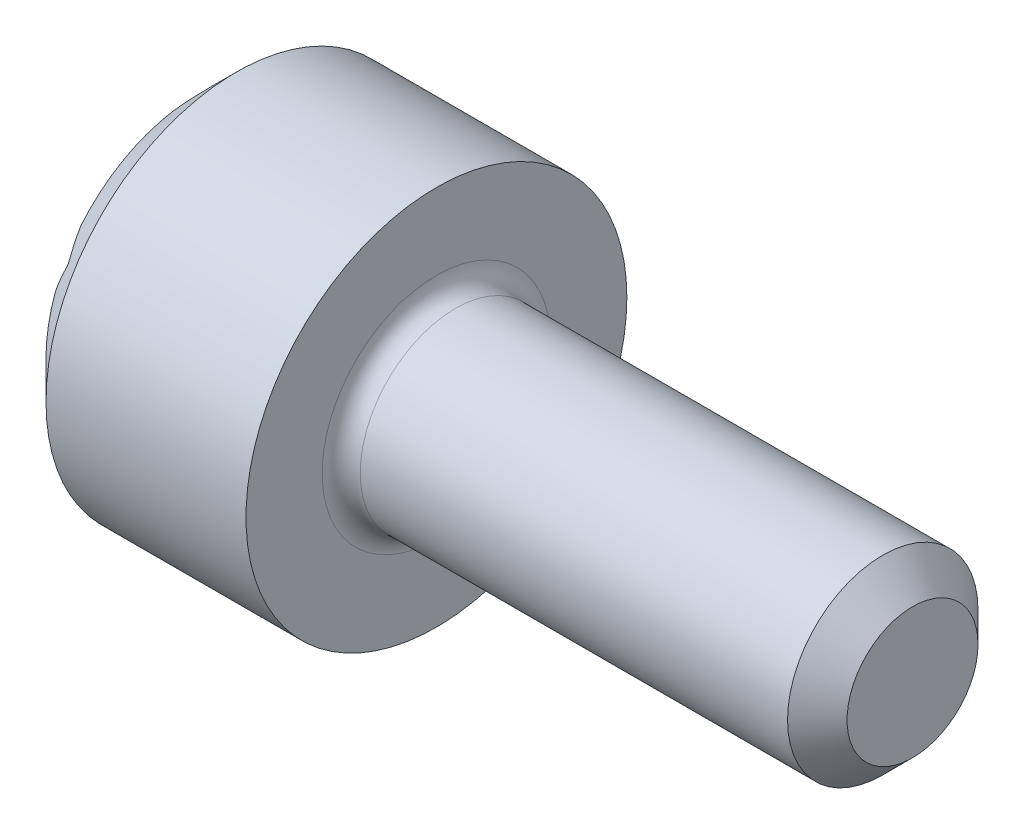
ISO-10303-21;
HEADER;
FILE_DESCRIPTION(('STEP AP214'),'2;1');
FILE_NAME('part.step','',(''),(''),'','','');
FILE_SCHEMA(('AUTOMOTIVE_DESIGN { 1 0 10303 214 1 1 1 1 }'));
ENDSEC;
DATA;
#1=APPLICATION_CONTEXT('core data for automotive mechanical design processes');
#2=APPLICATION_PROTOCOL_DEFINITION('international standard','automotive_design',2000,#1);
#3=PRODUCT_CONTEXT('',#1,'mechanical');
#4=PRODUCT('Part','Part','',(#3));
#5=PRODUCT_RELATED_PRODUCT_CATEGORY('part','',(#4));
#6=PRODUCT_DEFINITION_FORMATION('','',#4);
#7=PRODUCT_DEFINITION_CONTEXT('part definition',#1,'design');
#8=PRODUCT_DEFINITION('design','',#6,#7);
#9=PRODUCT_DEFINITION_SHAPE('','',#8);
#10=(LENGTH_UNIT() NAMED_UNIT(*) SI_UNIT(.MILLI.,.METRE.));
#11=(NAMED_UNIT(*) PLANE_ANGLE_UNIT() SI_UNIT($,.RADIAN.));
#12=(NAMED_UNIT(*) SI_UNIT($,.STERADIAN.) SOLID_ANGLE_UNIT());
#13=UNCERTAINTY_MEASURE_WITH_UNIT(LENGTH_MEASURE(1.E-05),#10,'distance_accuracy_value','');
#14=(GEOMETRIC_REPRESENTATION_CONTEXT(3) GLOBAL_UNCERTAINTY_ASSIGNED_CONTEXT((#13)) GLOBAL_UNIT_ASSIGNED_CONTEXT((#10,
#11,#12)) REPRESENTATION_CONTEXT('',''));
#15=CARTESIAN_POINT('',(0.,0.,0.));
#16=DIRECTION('',(0.,0.,1.));
#17=DIRECTION('',(1.,0.,0.));
#18=AXIS2_PLACEMENT_3D('',#15,#16,#17);
#19=CARTESIAN_POINT('',(0.,0.,0.));
#20=DIRECTION('',(-1.,0.,0.));
#21=DIRECTION('',(0.,0.,1.));
#22=AXIS2_PLACEMENT_3D('',#19,#20,#21);
#23=PLANE('',#22);
#24=DIRECTION('',(0.,0.5,-0.866025403784439));
#25=VECTOR('',#24,1.);
#26=CARTESIAN_POINT('',(0.,1.73205080756888,3.));
#27=LINE('',#26,#25);
#28=CARTESIAN_POINT('',(0.,2.04129977507032,2.46436507609928));
#29=VERTEX_POINT('',#28);
#30=CARTESIAN_POINT('',(0.,3.15485264763631,0.535634923900718));
#31=VERTEX_POINT('',#30);
#32=EDGE_CURVE('E191',#29,#31,#27,.T.);
#33=ORIENTED_EDGE('',*,*,#32,.F.);
#34=CARTESIAN_POINT('',(0.,0.,0.));
#35=DIRECTION('',(-1.,0.,0.));
#36=DIRECTION('',(0.,0.,1.));
#37=AXIS2_PLACEMENT_3D('',#34,#35,#36);
#38=CIRCLE('',#37,3.19999999999999);
#39=EDGE_CURVE('E238',#29,#31,#38,.T.);
#40=ORIENTED_EDGE('',*,*,#39,.T.);
#41=EDGE_LOOP('',(#33,#40));
#42=FACE_BOUND('',#41,.T.);
#43=ADVANCED_FACE('F33',(#42),#23,.T.);
#44=DIRECTION('',(0.,-0.5,-0.866025403784439));
#45=VECTOR('',#44,1.);
#46=CARTESIAN_POINT('',(0.,3.46410161513775,0.));
#47=LINE('',#46,#45);
#48=CARTESIAN_POINT('',(0.,3.15485264763631,-0.53563492390072));
#49=VERTEX_POINT('',#48);
#50=CARTESIAN_POINT('',(0.,2.04129977507032,-2.46436507609928));
#51=VERTEX_POINT('',#50);
#52=EDGE_CURVE('E194',#49,#51,#47,.T.);
#53=ORIENTED_EDGE('',*,*,#52,.F.);
#54=CARTESIAN_POINT('',(0.,0.,0.));
#55=DIRECTION('',(-1.,0.,0.));
#56=DIRECTION('',(0.,0.,1.));
#57=AXIS2_PLACEMENT_3D('',#54,#55,#56);
#58=CIRCLE('',#57,3.19999999999999);
#59=EDGE_CURVE('E236',#49,#51,#58,.T.);
#60=ORIENTED_EDGE('',*,*,#59,.T.);
#61=EDGE_LOOP('',(#53,#60));
#62=FACE_BOUND('',#61,.T.);
#63=ADVANCED_FACE('F303',(#62),#23,.T.);
#64=DIRECTION('',(0.,-1.,0.));
#65=VECTOR('',#64,1.);
#66=CARTESIAN_POINT('',(0.,1.73205080756888,-3.));
#67=LINE('',#66,#65);
#68=CARTESIAN_POINT('',(0.,1.11355287256599,-3.));
#69=VERTEX_POINT('',#68);
#70=CARTESIAN_POINT('',(0.,-1.11355287256599,-3.));
#71=VERTEX_POINT('',#70);
#72=EDGE_CURVE('E156',#69,#71,#67,.T.);
#73=ORIENTED_EDGE('',*,*,#72,.F.);
#74=CARTESIAN_POINT('',(0.,0.,0.));
#75=DIRECTION('',(-1.,0.,0.));
#76=DIRECTION('',(0.,0.,1.));
#77=AXIS2_PLACEMENT_3D('',#74,#75,#76);
#78=CIRCLE('',#77,3.19999999999999);
#79=EDGE_CURVE('E234',#69,#71,#78,.T.);
#80=ORIENTED_EDGE('',*,*,#79,.T.);
#81=EDGE_LOOP('',(#73,#80));
#82=FACE_BOUND('',#81,.T.);
#83=ADVANCED_FACE('F310',(#82),#23,.T.);
#84=DIRECTION('',(0.,-0.5,0.866025403784439));
#85=VECTOR('',#84,1.);
#86=CARTESIAN_POINT('',(0.,-1.73205080756888,-3.));
#87=LINE('',#86,#85);
#88=CARTESIAN_POINT('',(0.,-2.04129977507032,-2.46436507609928));
#89=VERTEX_POINT('',#88);
#90=CARTESIAN_POINT('',(0.,-3.15485264763631,-0.53563492390072));
#91=VERTEX_POINT('',#90);
#92=EDGE_CURVE('E184',#89,#91,#87,.T.);
#93=ORIENTED_EDGE('',*,*,#92,.F.);
#94=CARTESIAN_POINT('',(0.,0.,0.));
#95=DIRECTION('',(-1.,0.,0.));
#96=DIRECTION('',(0.,0.,1.));
#97=AXIS2_PLACEMENT_3D('',#94,#95,#96);
#98=CIRCLE('',#97,3.19999999999999);
#99=EDGE_CURVE('E232',#89,#91,#98,.T.);
#100=ORIENTED_EDGE('',*,*,#99,.T.);
#101=EDGE_LOOP('',(#93,#100));
#102=FACE_BOUND('',#101,.T.);
#103=ADVANCED_FACE('F324',(#102),#23,.T.);
#104=DIRECTION('',(0.,0.5,0.866025403784439));
#105=VECTOR('',#104,1.);
#106=CARTESIAN_POINT('',(0.,-3.46410161513775,0.));
#107=LINE('',#106,#105);
#108=CARTESIAN_POINT('',(0.,-3.15485264763631,0.535634923900722));
#109=VERTEX_POINT('',#108);
#110=CARTESIAN_POINT('',(0.,-2.04129977507032,2.46436507609928));
#111=VERTEX_POINT('',#110);
#112=EDGE_CURVE('E186',#109,#111,#107,.T.);
#113=ORIENTED_EDGE('',*,*,#112,.F.);
#114=CARTESIAN_POINT('',(0.,0.,0.));
#115=DIRECTION('',(-1.,0.,0.));
#116=DIRECTION('',(0.,0.,1.));
#117=AXIS2_PLACEMENT_3D('',#114,#115,#116);
#118=CIRCLE('',#117,3.19999999999999);
#119=EDGE_CURVE('E230',#109,#111,#118,.T.);
#120=ORIENTED_EDGE('',*,*,#119,.T.);
#121=EDGE_LOOP('',(#113,#120));
#122=FACE_BOUND('',#121,.T.);
#123=ADVANCED_FACE('F316',(#122),#23,.T.);
#124=DIRECTION('',(0.,1.,0.));
#125=VECTOR('',#124,1.);
#126=CARTESIAN_POINT('',(0.,-1.73205080756888,3.));
#127=LINE('',#126,#125);
#128=CARTESIAN_POINT('',(0.,-1.11355287256599,3.));
#129=VERTEX_POINT('',#128);
#130=CARTESIAN_POINT('',(0.,1.11355287256599,3.));
#131=VERTEX_POINT('',#130);
#132=EDGE_CURVE('E188',#129,#131,#127,.T.);
#133=ORIENTED_EDGE('',*,*,#132,.F.);
#134=CARTESIAN_POINT('',(0.,0.,0.));
#135=DIRECTION('',(-1.,0.,0.));
#136=DIRECTION('',(0.,0.,1.));
#137=AXIS2_PLACEMENT_3D('',#134,#135,#136);
#138=CIRCLE('',#137,3.19999999999999);
#139=EDGE_CURVE('E228',#129,#131,#138,.T.);
#140=ORIENTED_EDGE('',*,*,#139,.T.);
#141=EDGE_LOOP('',(#133,#140));
#142=FACE_BOUND('',#141,.T.);
#143=ADVANCED_FACE('F306',(#142),#23,.T.);
#144=CARTESIAN_POINT('',(15.,0.,0.));
#145=DIRECTION('',(1.,0.,0.));
#146=DIRECTION('',(0.,0.,-1.));
#147=AXIS2_PLACEMENT_3D('',#144,#145,#146);
#148=CYLINDRICAL_SURFACE('',#147,4.);
#149=CARTESIAN_POINT('',(0.800000000000002,0.,0.));
#150=DIRECTION('',(-1.,0.,0.));
#151=DIRECTION('',(0.,0.,1.));
#152=AXIS2_PLACEMENT_3D('',#149,#150,#151);
#153=CIRCLE('',#152,4.);
#154=CARTESIAN_POINT('',(0.800000000000002,0.,4.));
#155=VERTEX_POINT('',#154);
#156=EDGE_CURVE('E225',#155,#155,#153,.F.);
#157=ORIENTED_EDGE('',*,*,#156,.T.);
#158=EDGE_LOOP('',(#157));
#159=FACE_BOUND('',#158,.T.);
#160=CARTESIAN_POINT('',(5.,0.,0.));
#161=DIRECTION('',(1.,0.,0.));
#162=DIRECTION('',(0.,0.,-1.));
#163=AXIS2_PLACEMENT_3D('',#160,#161,#162);
#164=CIRCLE('',#163,4.);
#165=CARTESIAN_POINT('',(5.,0.,-4.));
#166=VERTEX_POINT('',#165);
#167=EDGE_CURVE('E215',#166,#166,#164,.T.);
#168=ORIENTED_EDGE('',*,*,#167,.F.);
#169=EDGE_LOOP('',(#168));
#170=FACE_BOUND('',#169,.T.);
#171=ADVANCED_FACE('F315',(#159,#170),#148,.T.);
#172=CARTESIAN_POINT('',(5.,0.,-4.));
#173=DIRECTION('',(1.,0.,0.));
#174=DIRECTION('',(0.,0.,-1.));
#175=AXIS2_PLACEMENT_3D('',#172,#173,#174);
#176=PLANE('',#175);
#177=CARTESIAN_POINT('',(5.,0.,0.));
#178=DIRECTION('',(1.,0.,0.));
#179=DIRECTION('',(0.,0.,-1.));
#180=AXIS2_PLACEMENT_3D('',#177,#178,#179);
#181=CIRCLE('',#180,2.4);
#182=CARTESIAN_POINT('',(5.,0.,-2.4));
#183=VERTEX_POINT('',#182);
#184=EDGE_CURVE('E11',#183,#183,#181,.F.);
#185=ORIENTED_EDGE('',*,*,#184,.T.);
#186=EDGE_LOOP('',(#185));
#187=FACE_BOUND('',#186,.T.);
#188=ORIENTED_EDGE('',*,*,#167,.T.);
#189=EDGE_LOOP('',(#188));
#190=FACE_BOUND('',#189,.T.);
#191=ADVANCED_FACE('F322',(#187,#190),#176,.T.);
#192=CARTESIAN_POINT('',(15.,0.,0.));
#193=DIRECTION('',(1.,0.,0.));
#194=DIRECTION('',(0.,0.,-1.));
#195=AXIS2_PLACEMENT_3D('',#192,#193,#194);
#196=CYLINDRICAL_SURFACE('',#195,2.);
#197=CARTESIAN_POINT('',(5.4,0.,0.));
#198=DIRECTION('',(1.,0.,0.));
#199=DIRECTION('',(0.,0.,-1.));
#200=AXIS2_PLACEMENT_3D('',#197,#198,#199);
#201=CIRCLE('',#200,2.);
#202=CARTESIAN_POINT('',(5.4,0.,-2.));
#203=VERTEX_POINT('',#202);
#204=EDGE_CURVE('E41',#203,#203,#201,.T.);
#205=ORIENTED_EDGE('',*,*,#204,.T.);
#206=EDGE_LOOP('',(#205));
#207=FACE_BOUND('',#206,.T.);
#208=CARTESIAN_POINT('',(14.375,0.,0.));
#209=DIRECTION('',(1.,0.,0.));
#210=DIRECTION('',(0.,0.,-1.));
#211=AXIS2_PLACEMENT_3D('',#208,#209,#210);
#212=CIRCLE('',#211,2.);
#213=CARTESIAN_POINT('',(14.375,0.,-2.));
#214=VERTEX_POINT('',#213);
#215=EDGE_CURVE('E222',#214,#214,#212,.F.);
#216=ORIENTED_EDGE('',*,*,#215,.T.);
#217=EDGE_LOOP('',(#216));
#218=FACE_BOUND('',#217,.T.);
#219=ADVANCED_FACE('F291',(#207,#218),#196,.T.);
#220=CARTESIAN_POINT('',(15.,0.,-2.));
#221=DIRECTION('',(1.,0.,0.));
#222=DIRECTION('',(0.,0.,-1.));
#223=AXIS2_PLACEMENT_3D('',#220,#221,#222);
#224=PLANE('',#223);
#225=CARTESIAN_POINT('',(15.,0.,0.));
#226=DIRECTION('',(1.,0.,0.));
#227=DIRECTION('',(0.,0.,-1.));
#228=AXIS2_PLACEMENT_3D('',#225,#226,#227);
#229=CIRCLE('',#228,1.37499999999999);
#230=CARTESIAN_POINT('',(15.,0.,-1.37499999999999));
#231=VERTEX_POINT('',#230);
#232=EDGE_CURVE('E219',#231,#231,#229,.T.);
#233=ORIENTED_EDGE('',*,*,#232,.T.);
#234=EDGE_LOOP('',(#233));
#235=FACE_BOUND('',#234,.T.);
#236=ADVANCED_FACE('F367',(#235),#224,.T.);
#237=CARTESIAN_POINT('',(15.,0.,0.));
#238=DIRECTION('',(-1.,0.,0.));
#239=DIRECTION('',(0.,0.,1.));
#240=AXIS2_PLACEMENT_3D('',#237,#238,#239);
#241=CONICAL_SURFACE('',#240,1.37499999999999,0.785398163397445);
#242=ORIENTED_EDGE('',*,*,#215,.F.);
#243=EDGE_LOOP('',(#242));
#244=FACE_BOUND('',#243,.T.);
#245=ORIENTED_EDGE('',*,*,#232,.F.);
#246=EDGE_LOOP('',(#245));
#247=FACE_BOUND('',#246,.T.);
#248=ADVANCED_FACE('F361',(#244,#247),#241,.T.);
#249=CARTESIAN_POINT('',(4.,-1.73205080756888,-3.));
#250=DIRECTION('',(0.,-0.866025403784439,-0.5));
#251=DIRECTION('',(0.,0.5,-0.866025403784439));
#252=AXIS2_PLACEMENT_3D('',#249,#250,#251);
#253=PLANE('',#252);
#254=DIRECTION('',(-1.,0.,0.));
#255=VECTOR('',#254,1.);
#256=CARTESIAN_POINT('',(4.,-1.73205080756888,-3.));
#257=LINE('',#256,#255);
#258=CARTESIAN_POINT('',(4.,-1.73205080756888,-3.));
#259=VERTEX_POINT('',#258);
#260=CARTESIAN_POINT('',(0.26410161513776,-1.73205080756888,-3.));
#261=VERTEX_POINT('',#260);
#262=EDGE_CURVE('E199',#259,#261,#257,.T.);
#263=ORIENTED_EDGE('',*,*,#262,.T.);
#264=CARTESIAN_POINT('',(0.26410161513776,-1.73205080756888,-3.));
#265=CARTESIAN_POINT('',(0.239013045834172,-1.75714195340964,-2.95654086058369));
#266=CARTESIAN_POINT('',(0.214572473907921,-1.78239782369679,-2.91279641005696));
#267=CARTESIAN_POINT('',(0.167188466711547,-1.83322609179336,-2.82475926725298));
#268=CARTESIAN_POINT('',(0.144243512742114,-1.85879813612875,-2.78046718721067));
#269=CARTESIAN_POINT('',(0.0999964216523169,-1.91030100221666,-2.69126160641101));
#270=CARTESIAN_POINT('',(0.0786945049648067,-1.93623187156128,-2.64634802322169));
#271=CARTESIAN_POINT('',(0.0379179650521348,-1.988480607889,-2.5558505572708));
#272=CARTESIAN_POINT('',(0.0184452524003184,-2.01479884701434,-2.51026602993998));
#273=CARTESIAN_POINT('',(0.,-2.04129977507032,-2.46436507609928));
#274=B_SPLINE_CURVE_WITH_KNOTS('',3,(#264,#265,#266,#267,#268,#269,#270,#271,#272,#273),
.UNSPECIFIED.,.F.,.F.,(4,2,2,2,4),(0.,0.168315435098067,0.33645720542302,0.50462149485538,
0.67295952029934),.UNSPECIFIED.);
#275=EDGE_CURVE('E336',#261,#89,#274,.T.);
#276=ORIENTED_EDGE('',*,*,#275,.T.);
#277=ORIENTED_EDGE('',*,*,#92,.T.);
#278=CARTESIAN_POINT('',(0.,-3.15485264763631,-0.53563492390072));
#279=CARTESIAN_POINT('',(0.018445252400318,-3.1813535756923,-0.489733970060022));
#280=CARTESIAN_POINT('',(0.0379179650521346,-3.20767181481763,-0.444149442729198));
#281=CARTESIAN_POINT('',(0.0786945049648066,-3.25992055114535,-0.353651976778308));
#282=CARTESIAN_POINT('',(0.0999964216523168,-3.28585142048998,-0.308738393588992));
#283=CARTESIAN_POINT('',(0.144243512742114,-3.33735428657788,-0.219532812789329));
#284=CARTESIAN_POINT('',(0.167188466711547,-3.36292633091328,-0.175240732747018));
#285=CARTESIAN_POINT('',(0.214572473907921,-3.41375459900984,-0.087203589943041));
#286=CARTESIAN_POINT('',(0.239013045834172,-3.439010469297,-0.0434591394163141));
#287=CARTESIAN_POINT('',(0.26410161513776,-3.46410161513775,0.));
#288=B_SPLINE_CURVE_WITH_KNOTS('',3,(#278,#279,#280,#281,#282,#283,#284,#285,#286,#287),
.UNSPECIFIED.,.F.,.F.,(4,2,2,2,4),(0.,0.16833802544396,0.33650231487632,0.504644085201273,
0.67295952029934),.UNSPECIFIED.);
#289=CARTESIAN_POINT('',(0.26410161513776,-3.46410161513775,0.));
#290=VERTEX_POINT('',#289);
#291=EDGE_CURVE('E56',#91,#290,#288,.T.);
#292=ORIENTED_EDGE('',*,*,#291,.T.);
#293=DIRECTION('',(-1.,0.,0.));
#294=VECTOR('',#293,1.);
#295=CARTESIAN_POINT('',(4.,-3.46410161513775,0.));
#296=LINE('',#295,#294);
#297=CARTESIAN_POINT('',(4.,-3.46410161513775,0.));
#298=VERTEX_POINT('',#297);
#299=EDGE_CURVE('E158',#298,#290,#296,.T.);
#300=ORIENTED_EDGE('',*,*,#299,.F.);
#301=DIRECTION('',(0.,-0.5,0.866025403784439));
#302=VECTOR('',#301,1.);
#303=CARTESIAN_POINT('',(4.,-1.73205080756888,-3.));
#304=LINE('',#303,#302);
#305=CARTESIAN_POINT('',(4.,-2.59807621135332,-1.5));
#306=VERTEX_POINT('',#305);
#307=EDGE_CURVE('E147',#306,#298,#304,.T.);
#308=ORIENTED_EDGE('',*,*,#307,.F.);
#309=EDGE_CURVE('E155',#259,#306,#304,.T.);
#310=ORIENTED_EDGE('',*,*,#309,.F.);
#311=EDGE_LOOP('',(#263,#276,#277,#292,#300,#308,#310));
#312=FACE_BOUND('',#311,.T.);
#313=ADVANCED_FACE('F160',(#312),#253,.F.);
#314=CARTESIAN_POINT('',(4.,1.73205080756888,-3.));
#315=DIRECTION('',(0.,0.,-1.));
#316=DIRECTION('',(-1.,0.,0.));
#317=AXIS2_PLACEMENT_3D('',#314,#315,#316);
#318=PLANE('',#317);
#319=DIRECTION('',(-1.,0.,0.));
#320=VECTOR('',#319,1.);
#321=CARTESIAN_POINT('',(4.,1.73205080756888,-3.));
#322=LINE('',#321,#320);
#323=CARTESIAN_POINT('',(4.,1.73205080756888,-3.));
#324=VERTEX_POINT('',#323);
#325=CARTESIAN_POINT('',(0.26410161513776,1.73205080756888,-3.));
#326=VERTEX_POINT('',#325);
#327=EDGE_CURVE('E202',#324,#326,#322,.T.);
#328=ORIENTED_EDGE('',*,*,#327,.T.);
#329=CARTESIAN_POINT('',(0.26410161513776,1.73205080756888,-3.));
#330=CARTESIAN_POINT('',(0.239013045834172,1.68186851588736,-3.));
#331=CARTESIAN_POINT('',(0.214572473907921,1.63135677531304,-3.));
#332=CARTESIAN_POINT('',(0.167188466711547,1.52970023911992,-3.));
#333=CARTESIAN_POINT('',(0.144243512742114,1.47855615044913,-3.));
#334=CARTESIAN_POINT('',(0.099996421652317,1.37555041827332,-3.));
#335=CARTESIAN_POINT('',(0.0786945049648069,1.32368867958408,-3.));
#336=CARTESIAN_POINT('',(0.0379179650521349,1.21919120692863,-3.));
#337=CARTESIAN_POINT('',(0.0184452524003184,1.16655472867796,-3.));
#338=CARTESIAN_POINT('',(0.,1.11355287256599,-3.));
#339=B_SPLINE_CURVE_WITH_KNOTS('',3,(#329,#330,#331,#332,#333,#334,#335,#336,#337,#338),
.UNSPECIFIED.,.F.,.F.,(4,2,2,2,4),(0.,0.168315435098068,0.33645720542302,0.50462149485538,
0.672959520299341),.UNSPECIFIED.);
#340=EDGE_CURVE('E560',#326,#69,#339,.T.);
#341=ORIENTED_EDGE('',*,*,#340,.T.);
#342=ORIENTED_EDGE('',*,*,#72,.T.);
#343=CARTESIAN_POINT('',(0.,-1.11355287256599,-3.));
#344=CARTESIAN_POINT('',(0.0184452524003184,-1.16655472867796,-3.));
#345=CARTESIAN_POINT('',(0.0379179650521349,-1.21919120692863,-3.));
#346=CARTESIAN_POINT('',(0.0786945049648068,-1.32368867958408,-3.));
#347=CARTESIAN_POINT('',(0.0999964216523169,-1.37555041827332,-3.));
#348=CARTESIAN_POINT('',(0.144243512742114,-1.47855615044913,-3.));
#349=CARTESIAN_POINT('',(0.167188466711547,-1.52970023911992,-3.));
#350=CARTESIAN_POINT('',(0.214572473907921,-1.63135677531304,-3.));
#351=CARTESIAN_POINT('',(0.239013045834172,-1.68186851588736,-3.));
#352=CARTESIAN_POINT('',(0.26410161513776,-1.73205080756888,-3.));
#353=B_SPLINE_CURVE_WITH_KNOTS('',3,(#343,#344,#345,#346,#347,#348,#349,#350,#351,#352),
.UNSPECIFIED.,.F.,.F.,(4,2,2,2,4),(0.,0.16833802544396,0.336502314876321,0.504644085201273,
0.672959520299341),.UNSPECIFIED.);
#354=EDGE_CURVE('E561',#71,#261,#353,.T.);
#355=ORIENTED_EDGE('',*,*,#354,.T.);
#356=ORIENTED_EDGE('',*,*,#262,.F.);
#357=DIRECTION('',(0.,-1.,0.));
#358=VECTOR('',#357,1.);
#359=CARTESIAN_POINT('',(4.,1.73205080756888,-3.));
#360=LINE('',#359,#358);
#361=CARTESIAN_POINT('',(4.,0.,-3.));
#362=VERTEX_POINT('',#361);
#363=EDGE_CURVE('E181',#362,#259,#360,.T.);
#364=ORIENTED_EDGE('',*,*,#363,.F.);
#365=EDGE_CURVE('E163',#324,#362,#360,.T.);
#366=ORIENTED_EDGE('',*,*,#365,.F.);
#367=EDGE_LOOP('',(#328,#341,#342,#355,#356,#364,#366));
#368=FACE_BOUND('',#367,.T.);
#369=ADVANCED_FACE('F360',(#368),#318,.F.);
#370=CARTESIAN_POINT('',(4.,3.46410161513775,0.));
#371=DIRECTION('',(0.,0.866025403784439,-0.5));
#372=DIRECTION('',(0.,0.5,0.866025403784439));
#373=AXIS2_PLACEMENT_3D('',#370,#371,#372);
#374=PLANE('',#373);
#375=DIRECTION('',(-1.,0.,0.));
#376=VECTOR('',#375,1.);
#377=CARTESIAN_POINT('',(4.,3.46410161513775,0.));
#378=LINE('',#377,#376);
#379=CARTESIAN_POINT('',(4.,3.46410161513775,0.));
#380=VERTEX_POINT('',#379);
#381=CARTESIAN_POINT('',(0.264101615137759,3.46410161513775,0.));
#382=VERTEX_POINT('',#381);
#383=EDGE_CURVE('E205',#380,#382,#378,.T.);
#384=ORIENTED_EDGE('',*,*,#383,.T.);
#385=CARTESIAN_POINT('',(0.264101615137759,3.46410161513775,0.));
#386=CARTESIAN_POINT('',(0.239013045834171,3.439010469297,-0.0434591394163141));
#387=CARTESIAN_POINT('',(0.21457247390792,3.41375459900984,-0.087203589943041));
#388=CARTESIAN_POINT('',(0.167188466711547,3.36292633091328,-0.175240732747018));
#389=CARTESIAN_POINT('',(0.144243512742114,3.33735428657788,-0.219532812789329));
#390=CARTESIAN_POINT('',(0.0999964216523165,3.28585142048998,-0.308738393588992));
#391=CARTESIAN_POINT('',(0.0786945049648062,3.25992055114535,-0.353651976778308));
#392=CARTESIAN_POINT('',(0.037917965052134,3.20767181481763,-0.444149442729198));
#393=CARTESIAN_POINT('',(0.0184452524003176,3.1813535756923,-0.489733970060022));
#394=CARTESIAN_POINT('',(0.,3.15485264763631,-0.53563492390072));
#395=B_SPLINE_CURVE_WITH_KNOTS('',3,(#385,#386,#387,#388,#389,#390,#391,#392,#393,#394),
.UNSPECIFIED.,.F.,.F.,(4,2,2,2,4),(0.,0.168315435098067,0.33645720542302,0.504621494855379,
0.672959520299339),.UNSPECIFIED.);
#396=EDGE_CURVE('E564',#382,#49,#395,.T.);
#397=ORIENTED_EDGE('',*,*,#396,.T.);
#398=ORIENTED_EDGE('',*,*,#52,.T.);
#399=CARTESIAN_POINT('',(0.,2.04129977507032,-2.46436507609928));
#400=CARTESIAN_POINT('',(0.0184452524003182,2.01479884701434,-2.51026602993998));
#401=CARTESIAN_POINT('',(0.0379179650521348,1.988480607889,-2.5558505572708));
#402=CARTESIAN_POINT('',(0.0786945049648071,1.93623187156128,-2.64634802322169));
#403=CARTESIAN_POINT('',(0.0999964216523173,1.91030100221666,-2.69126160641101));
#404=CARTESIAN_POINT('',(0.144243512742114,1.85879813612875,-2.78046718721067));
#405=CARTESIAN_POINT('',(0.167188466711547,1.83322609179336,-2.82475926725298));
#406=CARTESIAN_POINT('',(0.214572473907921,1.78239782369679,-2.91279641005696));
#407=CARTESIAN_POINT('',(0.239013045834172,1.75714195340964,-2.95654086058369));
#408=CARTESIAN_POINT('',(0.26410161513776,1.73205080756888,-3.));
#409=B_SPLINE_CURVE_WITH_KNOTS('',3,(#399,#400,#401,#402,#403,#404,#405,#406,#407,#408),
.UNSPECIFIED.,.F.,.F.,(4,2,2,2,4),(0.,0.16833802544396,0.33650231487632,0.504644085201273,
0.672959520299341),.UNSPECIFIED.);
#410=EDGE_CURVE('E581',#51,#326,#409,.T.);
#411=ORIENTED_EDGE('',*,*,#410,.T.);
#412=ORIENTED_EDGE('',*,*,#327,.F.);
#413=DIRECTION('',(0.,-0.5,-0.866025403784439));
#414=VECTOR('',#413,1.);
#415=CARTESIAN_POINT('',(4.,3.46410161513775,0.));
#416=LINE('',#415,#414);
#417=CARTESIAN_POINT('',(4.,2.59807621135332,-1.5));
#418=VERTEX_POINT('',#417);
#419=EDGE_CURVE('E177',#418,#324,#416,.T.);
#420=ORIENTED_EDGE('',*,*,#419,.F.);
#421=EDGE_CURVE('E178',#380,#418,#416,.T.);
#422=ORIENTED_EDGE('',*,*,#421,.F.);
#423=EDGE_LOOP('',(#384,#397,#398,#411,#412,#420,#422));
#424=FACE_BOUND('',#423,.T.);
#425=ADVANCED_FACE('F263',(#424),#374,.F.);
#426=CARTESIAN_POINT('',(4.,1.73205080756888,3.));
#427=DIRECTION('',(0.,0.866025403784439,0.5));
#428=DIRECTION('',(0.,-0.5,0.866025403784439));
#429=AXIS2_PLACEMENT_3D('',#426,#427,#428);
#430=PLANE('',#429);
#431=ORIENTED_EDGE('',*,*,#32,.T.);
#432=CARTESIAN_POINT('',(0.,3.15485264763631,0.535634923900717));
#433=CARTESIAN_POINT('',(0.0184452524003182,3.1813535756923,0.48973397006002));
#434=CARTESIAN_POINT('',(0.0379179650521348,3.20767181481763,0.444149442729196));
#435=CARTESIAN_POINT('',(0.0786945049648068,3.25992055114536,0.353651976778307));
#436=CARTESIAN_POINT('',(0.0999964216523167,3.28585142048998,0.308738393588991));
#437=CARTESIAN_POINT('',(0.144243512742114,3.33735428657788,0.219532812789328));
#438=CARTESIAN_POINT('',(0.167188466711547,3.36292633091328,0.175240732747018));
#439=CARTESIAN_POINT('',(0.21457247390792,3.41375459900984,0.0872035899430407));
#440=CARTESIAN_POINT('',(0.239013045834172,3.439010469297,0.0434591394163138));
#441=CARTESIAN_POINT('',(0.264101615137759,3.46410161513775,0.));
#442=B_SPLINE_CURVE_WITH_KNOTS('',3,(#432,#433,#434,#435,#436,#437,#438,#439,#440,#441),
.UNSPECIFIED.,.F.,.F.,(4,2,2,2,4),(0.,0.16833802544396,0.336502314876319,0.504644085201271,
0.672959520299338),.UNSPECIFIED.);
#443=EDGE_CURVE('E248',#31,#382,#442,.T.);
#444=ORIENTED_EDGE('',*,*,#443,.T.);
#445=ORIENTED_EDGE('',*,*,#383,.F.);
#446=DIRECTION('',(0.,0.5,-0.866025403784439));
#447=VECTOR('',#446,1.);
#448=CARTESIAN_POINT('',(4.,1.73205080756888,3.));
#449=LINE('',#448,#447);
#450=CARTESIAN_POINT('',(4.,2.59807621135332,1.5));
#451=VERTEX_POINT('',#450);
#452=EDGE_CURVE('E173',#451,#380,#449,.T.);
#453=ORIENTED_EDGE('',*,*,#452,.F.);
#454=CARTESIAN_POINT('',(4.,1.73205080756888,3.));
#455=VERTEX_POINT('',#454);
#456=EDGE_CURVE('E174',#455,#451,#449,.T.);
#457=ORIENTED_EDGE('',*,*,#456,.F.);
#458=DIRECTION('',(-1.,0.,0.));
#459=VECTOR('',#458,1.);
#460=CARTESIAN_POINT('',(4.,1.73205080756888,3.));
#461=LINE('',#460,#459);
#462=CARTESIAN_POINT('',(0.264101615137759,1.73205080756888,3.));
#463=VERTEX_POINT('',#462);
#464=EDGE_CURVE('E208',#455,#463,#461,.T.);
#465=ORIENTED_EDGE('',*,*,#464,.T.);
#466=CARTESIAN_POINT('',(0.264101615137759,1.73205080756888,3.));
#467=CARTESIAN_POINT('',(0.239013045834172,1.75714195340964,2.95654086058369));
#468=CARTESIAN_POINT('',(0.21457247390792,1.78239782369679,2.91279641005696));
#469=CARTESIAN_POINT('',(0.167188466711547,1.83322609179335,2.82475926725298));
#470=CARTESIAN_POINT('',(0.144243512742114,1.85879813612875,2.78046718721067));
#471=CARTESIAN_POINT('',(0.0999964216523163,1.91030100221665,2.69126160641101));
#472=CARTESIAN_POINT('',(0.0786945049648063,1.93623187156128,2.64634802322169));
#473=CARTESIAN_POINT('',(0.0379179650521344,1.988480607889,2.5558505572708));
#474=CARTESIAN_POINT('',(0.0184452524003179,2.01479884701433,2.51026602993998));
#475=CARTESIAN_POINT('',(0.,2.04129977507032,2.46436507609928));
#476=B_SPLINE_CURVE_WITH_KNOTS('',3,(#466,#467,#468,#469,#470,#471,#472,#473,#474,#475),
.UNSPECIFIED.,.F.,.F.,(4,2,2,2,4),(0.,0.168315435098067,0.336457205423019,0.504621494855379,
0.672959520299339),.UNSPECIFIED.);
#477=EDGE_CURVE('E241',#463,#29,#476,.T.);
#478=ORIENTED_EDGE('',*,*,#477,.T.);
#479=EDGE_LOOP('',(#431,#444,#445,#453,#457,#465,#478));
#480=FACE_BOUND('',#479,.T.);
#481=ADVANCED_FACE('F257',(#480),#430,.F.);
#482=CARTESIAN_POINT('',(4.,-1.73205080756888,3.));
#483=DIRECTION('',(0.,0.,1.));
#484=DIRECTION('',(0.,-1.,0.));
#485=AXIS2_PLACEMENT_3D('',#482,#483,#484);
#486=PLANE('',#485);
#487=DIRECTION('',(-1.,0.,0.));
#488=VECTOR('',#487,1.);
#489=CARTESIAN_POINT('',(4.,-1.73205080756888,3.));
#490=LINE('',#489,#488);
#491=CARTESIAN_POINT('',(4.,-1.73205080756888,3.));
#492=VERTEX_POINT('',#491);
#493=CARTESIAN_POINT('',(0.26410161513776,-1.73205080756888,3.));
#494=VERTEX_POINT('',#493);
#495=EDGE_CURVE('E162',#492,#494,#490,.T.);
#496=ORIENTED_EDGE('',*,*,#495,.T.);
#497=CARTESIAN_POINT('',(0.26410161513776,-1.73205080756888,3.));
#498=CARTESIAN_POINT('',(0.239013045834172,-1.68186851588736,3.));
#499=CARTESIAN_POINT('',(0.214572473907921,-1.63135677531304,3.));
#500=CARTESIAN_POINT('',(0.167188466711547,-1.52970023911992,3.));
#501=CARTESIAN_POINT('',(0.144243512742114,-1.47855615044913,3.));
#502=CARTESIAN_POINT('',(0.0999964216523166,-1.37555041827332,3.));
#503=CARTESIAN_POINT('',(0.0786945049648064,-1.32368867958408,3.));
#504=CARTESIAN_POINT('',(0.0379179650521343,-1.21919120692863,3.));
#505=CARTESIAN_POINT('',(0.0184452524003178,-1.16655472867796,3.));
#506=CARTESIAN_POINT('',(0.,-1.11355287256599,3.));
#507=B_SPLINE_CURVE_WITH_KNOTS('',3,(#497,#498,#499,#500,#501,#502,#503,#504,#505,#506),
.UNSPECIFIED.,.F.,.F.,(4,2,2,2,4),(0.,0.168315435098068,0.336457205423021,0.504621494855381,
0.672959520299342),.UNSPECIFIED.);
#508=EDGE_CURVE('E283',#494,#129,#507,.T.);
#509=ORIENTED_EDGE('',*,*,#508,.T.);
#510=ORIENTED_EDGE('',*,*,#132,.T.);
#511=CARTESIAN_POINT('',(0.,1.11355287256599,3.));
#512=CARTESIAN_POINT('',(0.0184452524003178,1.16655472867796,3.));
#513=CARTESIAN_POINT('',(0.0379179650521344,1.21919120692863,3.));
#514=CARTESIAN_POINT('',(0.0786945049648064,1.32368867958408,3.));
#515=CARTESIAN_POINT('',(0.0999964216523165,1.37555041827332,3.));
#516=CARTESIAN_POINT('',(0.144243512742114,1.47855615044913,3.));
#517=CARTESIAN_POINT('',(0.167188466711546,1.52970023911992,3.));
#518=CARTESIAN_POINT('',(0.21457247390792,1.63135677531304,3.));
#519=CARTESIAN_POINT('',(0.239013045834172,1.68186851588736,3.));
#520=CARTESIAN_POINT('',(0.264101615137759,1.73205080756888,3.));
#521=B_SPLINE_CURVE_WITH_KNOTS('',3,(#511,#512,#513,#514,#515,#516,#517,#518,#519,#520),
.UNSPECIFIED.,.F.,.F.,(4,2,2,2,4),(0.,0.16833802544396,0.33650231487632,0.504644085201273,
0.67295952029934),.UNSPECIFIED.);
#522=EDGE_CURVE('E276',#131,#463,#521,.T.);
#523=ORIENTED_EDGE('',*,*,#522,.T.);
#524=ORIENTED_EDGE('',*,*,#464,.F.);
#525=DIRECTION('',(0.,1.,0.));
#526=VECTOR('',#525,1.);
#527=CARTESIAN_POINT('',(4.,-1.73205080756888,3.));
#528=LINE('',#527,#526);
#529=CARTESIAN_POINT('',(4.,0.,3.));
#530=VERTEX_POINT('',#529);
#531=EDGE_CURVE('E168',#530,#455,#528,.T.);
#532=ORIENTED_EDGE('',*,*,#531,.F.);
#533=EDGE_CURVE('E170',#492,#530,#528,.T.);
#534=ORIENTED_EDGE('',*,*,#533,.F.);
#535=EDGE_LOOP('',(#496,#509,#510,#523,#524,#532,#534));
#536=FACE_BOUND('',#535,.T.);
#537=ADVANCED_FACE('F262',(#536),#486,.F.);
#538=CARTESIAN_POINT('',(4.,-3.46410161513775,0.));
#539=DIRECTION('',(0.,-0.866025403784439,0.5));
#540=DIRECTION('',(0.,-0.5,-0.866025403784439));
#541=AXIS2_PLACEMENT_3D('',#538,#539,#540);
#542=PLANE('',#541);
#543=ORIENTED_EDGE('',*,*,#299,.T.);
#544=CARTESIAN_POINT('',(0.26410161513776,-3.46410161513775,0.));
#545=CARTESIAN_POINT('',(0.239013045834172,-3.439010469297,0.043459139416314));
#546=CARTESIAN_POINT('',(0.21457247390792,-3.41375459900984,0.0872035899430412));
#547=CARTESIAN_POINT('',(0.167188466711547,-3.36292633091328,0.175240732747019));
#548=CARTESIAN_POINT('',(0.144243512742114,-3.33735428657788,0.21953281278933));
#549=CARTESIAN_POINT('',(0.0999964216523164,-3.28585142048998,0.308738393588993));
#550=CARTESIAN_POINT('',(0.0786945049648062,-3.25992055114535,0.353651976778309));
#551=CARTESIAN_POINT('',(0.0379179650521342,-3.20767181481763,0.444149442729199));
#552=CARTESIAN_POINT('',(0.0184452524003176,-3.1813535756923,0.489733970060024));
#553=CARTESIAN_POINT('',(0.,-3.15485264763631,0.535634923900722));
#554=B_SPLINE_CURVE_WITH_KNOTS('',3,(#544,#545,#546,#547,#548,#549,#550,#551,#552,#553),
.UNSPECIFIED.,.F.,.F.,(4,2,2,2,4),(0.,0.168315435098068,0.336457205423021,0.504621494855381,
0.672959520299342),.UNSPECIFIED.);
#555=EDGE_CURVE('E334',#290,#109,#554,.T.);
#556=ORIENTED_EDGE('',*,*,#555,.T.);
#557=ORIENTED_EDGE('',*,*,#112,.T.);
#558=CARTESIAN_POINT('',(0.,-2.04129977507033,2.46436507609928));
#559=CARTESIAN_POINT('',(0.0184452524003176,-2.01479884701434,2.51026602993998));
#560=CARTESIAN_POINT('',(0.0379179650521341,-1.988480607889,2.5558505572708));
#561=CARTESIAN_POINT('',(0.0786945049648063,-1.93623187156128,2.64634802322169));
#562=CARTESIAN_POINT('',(0.0999964216523167,-1.91030100221666,2.69126160641101));
#563=CARTESIAN_POINT('',(0.144243512742114,-1.85879813612875,2.78046718721067));
#564=CARTESIAN_POINT('',(0.167188466711547,-1.83322609179336,2.82475926725298));
#565=CARTESIAN_POINT('',(0.214572473907921,-1.7823978236968,2.91279641005696));
#566=CARTESIAN_POINT('',(0.239013045834172,-1.75714195340964,2.95654086058369));
#567=CARTESIAN_POINT('',(0.26410161513776,-1.73205080756888,3.));
#568=B_SPLINE_CURVE_WITH_KNOTS('',3,(#558,#559,#560,#561,#562,#563,#564,#565,#566,#567),
.UNSPECIFIED.,.F.,.F.,(4,2,2,2,4),(0.,0.168338025443961,0.336502314876322,0.504644085201275,
0.672959520299344),.UNSPECIFIED.);
#569=EDGE_CURVE('E48',#111,#494,#568,.T.);
#570=ORIENTED_EDGE('',*,*,#569,.T.);
#571=ORIENTED_EDGE('',*,*,#495,.F.);
#572=DIRECTION('',(0.,0.5,0.866025403784439));
#573=VECTOR('',#572,1.);
#574=CARTESIAN_POINT('',(4.,-3.46410161513775,0.));
#575=LINE('',#574,#573);
#576=CARTESIAN_POINT('',(4.,-2.59807621135332,1.5));
#577=VERTEX_POINT('',#576);
#578=EDGE_CURVE('E167',#577,#492,#575,.T.);
#579=ORIENTED_EDGE('',*,*,#578,.F.);
#580=EDGE_CURVE('E150',#298,#577,#575,.T.);
#581=ORIENTED_EDGE('',*,*,#580,.F.);
#582=EDGE_LOOP('',(#543,#556,#557,#570,#571,#579,#581));
#583=FACE_BOUND('',#582,.T.);
#584=ADVANCED_FACE('F166',(#583),#542,.F.);
#585=CARTESIAN_POINT('',(4.,0.,0.));
#586=DIRECTION('',(-1.,0.,0.));
#587=DIRECTION('',(0.,0.,1.));
#588=AXIS2_PLACEMENT_3D('',#585,#586,#587);
#589=PLANE('',#588);
#590=ORIENTED_EDGE('',*,*,#531,.T.);
#591=ORIENTED_EDGE('',*,*,#456,.T.);
#592=CARTESIAN_POINT('',(4.,0.,0.));
#593=DIRECTION('',(-1.,0.,0.));
#594=DIRECTION('',(0.,0.,1.));
#595=AXIS2_PLACEMENT_3D('',#592,#593,#594);
#596=CIRCLE('',#595,3.);
#597=EDGE_CURVE('E212',#530,#451,#596,.T.);
#598=ORIENTED_EDGE('',*,*,#597,.F.);
#599=EDGE_LOOP('',(#590,#591,#598));
#600=FACE_BOUND('',#599,.T.);
#601=ADVANCED_FACE('F428',(#600),#589,.T.);
#602=ORIENTED_EDGE('',*,*,#452,.T.);
#603=ORIENTED_EDGE('',*,*,#421,.T.);
#604=EDGE_CURVE('E216',#451,#418,#596,.T.);
#605=ORIENTED_EDGE('',*,*,#604,.F.);
#606=EDGE_LOOP('',(#602,#603,#605));
#607=FACE_BOUND('',#606,.T.);
#608=ADVANCED_FACE('F433',(#607),#589,.T.);
#609=ORIENTED_EDGE('',*,*,#419,.T.);
#610=ORIENTED_EDGE('',*,*,#365,.T.);
#611=EDGE_CURVE('E604',#418,#362,#596,.T.);
#612=ORIENTED_EDGE('',*,*,#611,.F.);
#613=EDGE_LOOP('',(#609,#610,#612));
#614=FACE_BOUND('',#613,.T.);
#615=ADVANCED_FACE('F441',(#614),#589,.T.);
#616=ORIENTED_EDGE('',*,*,#363,.T.);
#617=ORIENTED_EDGE('',*,*,#309,.T.);
#618=EDGE_CURVE('E599',#362,#306,#596,.T.);
#619=ORIENTED_EDGE('',*,*,#618,.F.);
#620=EDGE_LOOP('',(#616,#617,#619));
#621=FACE_BOUND('',#620,.T.);
#622=ADVANCED_FACE('F448',(#621),#589,.T.);
#623=ORIENTED_EDGE('',*,*,#307,.T.);
#624=ORIENTED_EDGE('',*,*,#580,.T.);
#625=EDGE_CURVE('E152',#306,#577,#596,.T.);
#626=ORIENTED_EDGE('',*,*,#625,.F.);
#627=EDGE_LOOP('',(#623,#624,#626));
#628=FACE_BOUND('',#627,.T.);
#629=ADVANCED_FACE('F148',(#628),#589,.T.);
#630=ORIENTED_EDGE('',*,*,#578,.T.);
#631=ORIENTED_EDGE('',*,*,#533,.T.);
#632=EDGE_CURVE('E201',#577,#530,#596,.T.);
#633=ORIENTED_EDGE('',*,*,#632,.F.);
#634=EDGE_LOOP('',(#630,#631,#633));
#635=FACE_BOUND('',#634,.T.);
#636=ADVANCED_FACE('F365',(#635),#589,.T.);
#637=CARTESIAN_POINT('',(5.7320508075689,0.,0.));
#638=DIRECTION('',(-1.,0.,0.));
#639=DIRECTION('',(0.,0.,1.));
#640=AXIS2_PLACEMENT_3D('',#637,#638,#639);
#641=CONICAL_SURFACE('',#640,0.,1.04719755119659);
#642=ORIENTED_EDGE('',*,*,#597,.T.);
#643=ORIENTED_EDGE('',*,*,#604,.T.);
#644=ORIENTED_EDGE('',*,*,#611,.T.);
#645=ORIENTED_EDGE('',*,*,#618,.T.);
#646=ORIENTED_EDGE('',*,*,#625,.T.);
#647=ORIENTED_EDGE('',*,*,#632,.T.);
#648=EDGE_LOOP('',(#642,#643,#644,#645,#646,#647));
#649=FACE_BOUND('',#648,.T.);
#650=CARTESIAN_POINT('',(5.7320508075689,0.,0.));
#651=VERTEX_POINT('',#650);
#652=VERTEX_LOOP('',#651);
#653=FACE_BOUND('',#652,.T.);
#654=ADVANCED_FACE('F299',(#649,#653),#641,.F.);
#655=CARTESIAN_POINT('',(0.800000000000002,0.,0.));
#656=DIRECTION('',(1.,0.,0.));
#657=DIRECTION('',(0.,0.,-1.));
#658=AXIS2_PLACEMENT_3D('',#655,#656,#657);
#659=CONICAL_SURFACE('',#658,4.,0.785398163397451);
#660=ORIENTED_EDGE('',*,*,#443,.F.);
#661=ORIENTED_EDGE('',*,*,#39,.F.);
#662=ORIENTED_EDGE('',*,*,#477,.F.);
#663=ORIENTED_EDGE('',*,*,#522,.F.);
#664=ORIENTED_EDGE('',*,*,#139,.F.);
#665=ORIENTED_EDGE('',*,*,#508,.F.);
#666=ORIENTED_EDGE('',*,*,#569,.F.);
#667=ORIENTED_EDGE('',*,*,#119,.F.);
#668=ORIENTED_EDGE('',*,*,#555,.F.);
#669=ORIENTED_EDGE('',*,*,#291,.F.);
#670=ORIENTED_EDGE('',*,*,#99,.F.);
#671=ORIENTED_EDGE('',*,*,#275,.F.);
#672=ORIENTED_EDGE('',*,*,#354,.F.);
#673=ORIENTED_EDGE('',*,*,#79,.F.);
#674=ORIENTED_EDGE('',*,*,#340,.F.);
#675=ORIENTED_EDGE('',*,*,#410,.F.);
#676=ORIENTED_EDGE('',*,*,#59,.F.);
#677=ORIENTED_EDGE('',*,*,#396,.F.);
#678=EDGE_LOOP('',(#660,#661,#662,#663,#664,#665,#666,#667,#668,#669,#670,#671,#672,#673,#674,
#675,#676,#677));
#679=FACE_BOUND('',#678,.T.);
#680=ORIENTED_EDGE('',*,*,#156,.F.);
#681=EDGE_LOOP('',(#680));
#682=FACE_BOUND('',#681,.T.);
#683=ADVANCED_FACE('F254',(#679,#682),#659,.T.);
#684=CARTESIAN_POINT('',(5.4,0.,0.));
#685=DIRECTION('',(1.,0.,0.));
#686=DIRECTION('',(0.,0.,-1.));
#687=AXIS2_PLACEMENT_3D('',#684,#685,#686);
#688=TOROIDAL_SURFACE('',#687,2.4,0.4);
#689=ORIENTED_EDGE('',*,*,#184,.F.);
#690=EDGE_LOOP('',(#689));
#691=FACE_BOUND('',#690,.T.);
#692=ORIENTED_EDGE('',*,*,#204,.F.);
#693=EDGE_LOOP('',(#692));
#694=FACE_BOUND('',#693,.T.);
#695=ADVANCED_FACE('F35',(#691,#694),#688,.F.);
#696=CLOSED_SHELL('',(#43,#63,#83,#103,#123,#143,#171,#191,#219,#236,#248,#313,#369,#425,#481,
#537,#584,#601,#608,#615,#622,#629,#636,#654,#683,#695));
#697=MANIFOLD_SOLID_BREP('B2',#696);
#698=ADVANCED_BREP_SHAPE_REPRESENTATION('',(#18,#697),#14);
#699=SHAPE_DEFINITION_REPRESENTATION(#9,#698);
ENDSEC;
END-ISO-10303-21;
